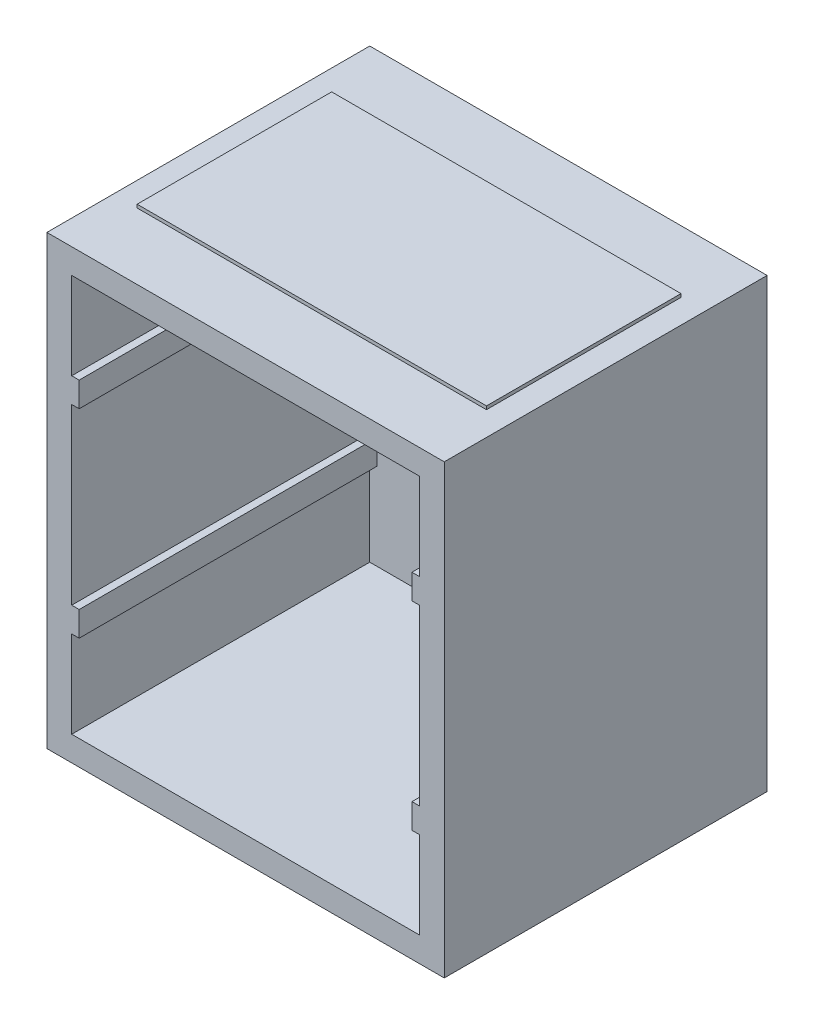
ISO-10303-21;
HEADER;
FILE_DESCRIPTION(('STEP AP214'),'2;1');
FILE_NAME('part.step','',(''),(''),'','','');
FILE_SCHEMA(('AUTOMOTIVE_DESIGN { 1 0 10303 214 1 1 1 1 }'));
ENDSEC;
DATA;
#1=APPLICATION_CONTEXT('core data for automotive mechanical design processes');
#2=APPLICATION_PROTOCOL_DEFINITION('international standard','automotive_design',2000,#1);
#3=PRODUCT_CONTEXT('',#1,'mechanical');
#4=PRODUCT('Part','Part','',(#3));
#5=PRODUCT_RELATED_PRODUCT_CATEGORY('part','',(#4));
#6=PRODUCT_DEFINITION_FORMATION('','',#4);
#7=PRODUCT_DEFINITION_CONTEXT('part definition',#1,'design');
#8=PRODUCT_DEFINITION('design','',#6,#7);
#9=PRODUCT_DEFINITION_SHAPE('','',#8);
#10=(LENGTH_UNIT() NAMED_UNIT(*) SI_UNIT(.MILLI.,.METRE.));
#11=(NAMED_UNIT(*) PLANE_ANGLE_UNIT() SI_UNIT($,.RADIAN.));
#12=(NAMED_UNIT(*) SI_UNIT($,.STERADIAN.) SOLID_ANGLE_UNIT());
#13=UNCERTAINTY_MEASURE_WITH_UNIT(LENGTH_MEASURE(1.E-05),#10,'distance_accuracy_value','');
#14=(GEOMETRIC_REPRESENTATION_CONTEXT(3) GLOBAL_UNCERTAINTY_ASSIGNED_CONTEXT((#13)) GLOBAL_UNIT_ASSIGNED_CONTEXT((#10,
#11,#12)) REPRESENTATION_CONTEXT('',''));
#15=CARTESIAN_POINT('',(0.,0.,0.));
#16=DIRECTION('',(0.,0.,1.));
#17=DIRECTION('',(1.,0.,0.));
#18=AXIS2_PLACEMENT_3D('',#15,#16,#17);
#19=CARTESIAN_POINT('',(133.35,171.45,-296.855381165919));
#20=DIRECTION('',(1.,0.,0.));
#21=DIRECTION('',(0.,1.,0.));
#22=AXIS2_PLACEMENT_3D('',#19,#20,#21);
#23=PLANE('',#22);
#24=DIRECTION('',(0.,1.,0.));
#25=VECTOR('',#24,1.);
#26=CARTESIAN_POINT('',(133.35,0.,-277.805381165919));
#27=LINE('',#26,#25);
#28=CARTESIAN_POINT('',(133.35,85.725,-277.805381165919));
#29=VERTEX_POINT('',#28);
#30=CARTESIAN_POINT('',(133.35,152.4,-277.805381165919));
#31=VERTEX_POINT('',#30);
#32=EDGE_CURVE('E377',#29,#31,#27,.T.);
#33=ORIENTED_EDGE('',*,*,#32,.F.);
#34=DIRECTION('',(0.,0.,1.));
#35=VECTOR('',#34,1.);
#36=CARTESIAN_POINT('',(133.35,85.725,-49.2053811659192));
#37=LINE('',#36,#35);
#38=CARTESIAN_POINT('',(133.35,85.725,-49.2053811659192));
#39=VERTEX_POINT('',#38);
#40=EDGE_CURVE('E252',#29,#39,#37,.T.);
#41=ORIENTED_EDGE('',*,*,#40,.T.);
#42=DIRECTION('',(0.,1.,0.));
#43=VECTOR('',#42,1.);
#44=CARTESIAN_POINT('',(133.35,0.,-49.2053811659192));
#45=LINE('',#44,#43);
#46=CARTESIAN_POINT('',(133.35,152.4,-49.2053811659192));
#47=VERTEX_POINT('',#46);
#48=EDGE_CURVE('E367',#39,#47,#45,.T.);
#49=ORIENTED_EDGE('',*,*,#48,.T.);
#50=DIRECTION('',(0.,0.,1.));
#51=VECTOR('',#50,1.);
#52=CARTESIAN_POINT('',(133.35,152.4,-296.855381165919));
#53=LINE('',#52,#51);
#54=EDGE_CURVE('E378',#31,#47,#53,.T.);
#55=ORIENTED_EDGE('',*,*,#54,.F.);
#56=EDGE_LOOP('',(#33,#41,#49,#55));
#57=FACE_BOUND('',#56,.T.);
#58=ADVANCED_FACE('F45',(#57),#23,.F.);
#59=CARTESIAN_POINT('',(133.35,-66.675,-49.2053811659192));
#60=VERTEX_POINT('',#59);
#61=CARTESIAN_POINT('',(133.35,66.675,-49.2053811659192));
#62=VERTEX_POINT('',#61);
#63=EDGE_CURVE('E399',#60,#62,#45,.T.);
#64=ORIENTED_EDGE('',*,*,#63,.T.);
#65=DIRECTION('',(0.,0.,-1.));
#66=VECTOR('',#65,1.);
#67=CARTESIAN_POINT('',(133.35,66.675,-49.2053811659192));
#68=LINE('',#67,#66);
#69=CARTESIAN_POINT('',(133.35,66.675,-277.805381165919));
#70=VERTEX_POINT('',#69);
#71=EDGE_CURVE('E255',#62,#70,#68,.T.);
#72=ORIENTED_EDGE('',*,*,#71,.T.);
#73=CARTESIAN_POINT('',(133.35,-66.675,-277.805381165919));
#74=VERTEX_POINT('',#73);
#75=EDGE_CURVE('E376',#74,#70,#27,.T.);
#76=ORIENTED_EDGE('',*,*,#75,.F.);
#77=DIRECTION('',(0.,0.,1.));
#78=VECTOR('',#77,1.);
#79=CARTESIAN_POINT('',(133.35,-66.675,-49.2053811659192));
#80=LINE('',#79,#78);
#81=EDGE_CURVE('E284',#74,#60,#80,.T.);
#82=ORIENTED_EDGE('',*,*,#81,.T.);
#83=EDGE_LOOP('',(#64,#72,#76,#82));
#84=FACE_BOUND('',#83,.T.);
#85=ADVANCED_FACE('F461',(#84),#23,.F.);
#86=CARTESIAN_POINT('',(-133.35,171.45,-296.855381165919));
#87=DIRECTION('',(-1.,0.,0.));
#88=DIRECTION('',(0.,-1.,0.));
#89=AXIS2_PLACEMENT_3D('',#86,#87,#88);
#90=PLANE('',#89);
#91=DIRECTION('',(0.,0.,-1.));
#92=VECTOR('',#91,1.);
#93=CARTESIAN_POINT('',(-133.35,66.675,-49.2053811659192));
#94=LINE('',#93,#92);
#95=CARTESIAN_POINT('',(-133.35,66.675,-49.2053811659192));
#96=VERTEX_POINT('',#95);
#97=CARTESIAN_POINT('',(-133.35,66.675,-277.805381165919));
#98=VERTEX_POINT('',#97);
#99=EDGE_CURVE('E326',#96,#98,#94,.T.);
#100=ORIENTED_EDGE('',*,*,#99,.F.);
#101=DIRECTION('',(0.,-1.,0.));
#102=VECTOR('',#101,1.);
#103=CARTESIAN_POINT('',(-133.35,0.,-49.2053811659192));
#104=LINE('',#103,#102);
#105=CARTESIAN_POINT('',(-133.35,-66.675,-49.2053811659192));
#106=VERTEX_POINT('',#105);
#107=EDGE_CURVE('E406',#96,#106,#104,.T.);
#108=ORIENTED_EDGE('',*,*,#107,.T.);
#109=DIRECTION('',(0.,0.,1.));
#110=VECTOR('',#109,1.);
#111=CARTESIAN_POINT('',(-133.35,-66.675,-49.2053811659192));
#112=LINE('',#111,#110);
#113=CARTESIAN_POINT('',(-133.35,-66.675,-277.805381165919));
#114=VERTEX_POINT('',#113);
#115=EDGE_CURVE('E344',#114,#106,#112,.T.);
#116=ORIENTED_EDGE('',*,*,#115,.F.);
#117=DIRECTION('',(0.,-1.,0.));
#118=VECTOR('',#117,1.);
#119=CARTESIAN_POINT('',(-133.35,0.,-277.805381165919));
#120=LINE('',#119,#118);
#121=EDGE_CURVE('E391',#98,#114,#120,.T.);
#122=ORIENTED_EDGE('',*,*,#121,.F.);
#123=EDGE_LOOP('',(#100,#108,#116,#122));
#124=FACE_BOUND('',#123,.T.);
#125=ADVANCED_FACE('F468',(#124),#90,.F.);
#126=DIRECTION('',(0.,0.,1.));
#127=VECTOR('',#126,1.);
#128=CARTESIAN_POINT('',(-133.35,85.725,-49.2053811659192));
#129=LINE('',#128,#127);
#130=CARTESIAN_POINT('',(-133.35,85.725,-277.805381165919));
#131=VERTEX_POINT('',#130);
#132=CARTESIAN_POINT('',(-133.35,85.725,-49.2053811659192));
#133=VERTEX_POINT('',#132);
#134=EDGE_CURVE('E323',#131,#133,#129,.T.);
#135=ORIENTED_EDGE('',*,*,#134,.F.);
#136=CARTESIAN_POINT('',(-133.35,152.4,-277.805381165919));
#137=VERTEX_POINT('',#136);
#138=EDGE_CURVE('E387',#137,#131,#120,.T.);
#139=ORIENTED_EDGE('',*,*,#138,.F.);
#140=DIRECTION('',(0.,0.,1.));
#141=VECTOR('',#140,1.);
#142=CARTESIAN_POINT('',(-133.35,152.4,-296.855381165919));
#143=LINE('',#142,#141);
#144=CARTESIAN_POINT('',(-133.35,152.4,-49.2053811659192));
#145=VERTEX_POINT('',#144);
#146=EDGE_CURVE('E381',#137,#145,#143,.T.);
#147=ORIENTED_EDGE('',*,*,#146,.T.);
#148=EDGE_CURVE('E403',#145,#133,#104,.T.);
#149=ORIENTED_EDGE('',*,*,#148,.T.);
#150=EDGE_LOOP('',(#135,#139,#147,#149));
#151=FACE_BOUND('',#150,.T.);
#152=ADVANCED_FACE('F528',(#151),#90,.F.);
#153=CARTESIAN_POINT('',(0.,0.,-277.805381165919));
#154=DIRECTION('',(0.,0.,1.));
#155=DIRECTION('',(1.,0.,0.));
#156=AXIS2_PLACEMENT_3D('',#153,#154,#155);
#157=PLANE('',#156);
#158=DIRECTION('',(1.,0.,0.));
#159=VECTOR('',#158,1.);
#160=CARTESIAN_POINT('',(127.635,85.725,-277.805381165919));
#161=LINE('',#160,#159);
#162=CARTESIAN_POINT('',(127.635,85.725,-277.805381165919));
#163=VERTEX_POINT('',#162);
#164=EDGE_CURVE('E279',#163,#29,#161,.T.);
#165=ORIENTED_EDGE('',*,*,#164,.T.);
#166=ORIENTED_EDGE('',*,*,#32,.T.);
#167=DIRECTION('',(-1.,0.,0.));
#168=VECTOR('',#167,1.);
#169=CARTESIAN_POINT('',(0.,152.4,-277.805381165919));
#170=LINE('',#169,#168);
#171=EDGE_CURVE('E375',#31,#137,#170,.T.);
#172=ORIENTED_EDGE('',*,*,#171,.T.);
#173=ORIENTED_EDGE('',*,*,#138,.T.);
#174=DIRECTION('',(-1.,0.,0.));
#175=VECTOR('',#174,1.);
#176=CARTESIAN_POINT('',(-127.635,85.725,-277.805381165919));
#177=LINE('',#176,#175);
#178=CARTESIAN_POINT('',(-127.635,85.725,-277.805381165919));
#179=VERTEX_POINT('',#178);
#180=EDGE_CURVE('E316',#179,#131,#177,.T.);
#181=ORIENTED_EDGE('',*,*,#180,.F.);
#182=DIRECTION('',(0.,1.,0.));
#183=VECTOR('',#182,1.);
#184=CARTESIAN_POINT('',(-127.635,85.725,-277.805381165919));
#185=LINE('',#184,#183);
#186=CARTESIAN_POINT('',(-127.635,66.675,-277.805381165919));
#187=VERTEX_POINT('',#186);
#188=EDGE_CURVE('E332',#187,#179,#185,.T.);
#189=ORIENTED_EDGE('',*,*,#188,.F.);
#190=DIRECTION('',(-1.,0.,0.));
#191=VECTOR('',#190,1.);
#192=CARTESIAN_POINT('',(-127.635,66.675,-277.805381165919));
#193=LINE('',#192,#191);
#194=EDGE_CURVE('E314',#187,#98,#193,.T.);
#195=ORIENTED_EDGE('',*,*,#194,.T.);
#196=ORIENTED_EDGE('',*,*,#121,.T.);
#197=DIRECTION('',(-1.,0.,0.));
#198=VECTOR('',#197,1.);
#199=CARTESIAN_POINT('',(-127.635,-66.675,-277.805381165919));
#200=LINE('',#199,#198);
#201=CARTESIAN_POINT('',(-127.635,-66.675,-277.805381165919));
#202=VERTEX_POINT('',#201);
#203=EDGE_CURVE('E359',#202,#114,#200,.T.);
#204=ORIENTED_EDGE('',*,*,#203,.F.);
#205=DIRECTION('',(0.,1.,0.));
#206=VECTOR('',#205,1.);
#207=CARTESIAN_POINT('',(-127.635,-66.675,-277.805381165919));
#208=LINE('',#207,#206);
#209=CARTESIAN_POINT('',(-127.635,-85.725,-277.805381165919));
#210=VERTEX_POINT('',#209);
#211=EDGE_CURVE('E347',#210,#202,#208,.T.);
#212=ORIENTED_EDGE('',*,*,#211,.F.);
#213=DIRECTION('',(-1.,0.,0.));
#214=VECTOR('',#213,1.);
#215=CARTESIAN_POINT('',(-127.635,-85.725,-277.805381165919));
#216=LINE('',#215,#214);
#217=CARTESIAN_POINT('',(-133.35,-85.725,-277.805381165919));
#218=VERTEX_POINT('',#217);
#219=EDGE_CURVE('E362',#210,#218,#216,.T.);
#220=ORIENTED_EDGE('',*,*,#219,.T.);
#221=CARTESIAN_POINT('',(-133.35,-152.4,-277.805381165919));
#222=VERTEX_POINT('',#221);
#223=EDGE_CURVE('E392',#218,#222,#120,.T.);
#224=ORIENTED_EDGE('',*,*,#223,.T.);
#225=DIRECTION('',(1.,0.,0.));
#226=VECTOR('',#225,1.);
#227=CARTESIAN_POINT('',(0.,-152.4,-277.805381165919));
#228=LINE('',#227,#226);
#229=CARTESIAN_POINT('',(133.35,-152.4,-277.805381165919));
#230=VERTEX_POINT('',#229);
#231=EDGE_CURVE('E382',#222,#230,#228,.T.);
#232=ORIENTED_EDGE('',*,*,#231,.T.);
#233=CARTESIAN_POINT('',(133.35,-85.725,-277.805381165919));
#234=VERTEX_POINT('',#233);
#235=EDGE_CURVE('E372',#230,#234,#27,.T.);
#236=ORIENTED_EDGE('',*,*,#235,.T.);
#237=DIRECTION('',(1.,0.,0.));
#238=VECTOR('',#237,1.);
#239=CARTESIAN_POINT('',(127.635,-85.725,-277.805381165919));
#240=LINE('',#239,#238);
#241=CARTESIAN_POINT('',(127.635,-85.725,-277.805381165919));
#242=VERTEX_POINT('',#241);
#243=EDGE_CURVE('E304',#242,#234,#240,.T.);
#244=ORIENTED_EDGE('',*,*,#243,.F.);
#245=DIRECTION('',(0.,1.,0.));
#246=VECTOR('',#245,1.);
#247=CARTESIAN_POINT('',(127.635,-66.675,-277.805381165919));
#248=LINE('',#247,#246);
#249=CARTESIAN_POINT('',(127.635,-66.675,-277.805381165919));
#250=VERTEX_POINT('',#249);
#251=EDGE_CURVE('E292',#242,#250,#248,.T.);
#252=ORIENTED_EDGE('',*,*,#251,.T.);
#253=DIRECTION('',(1.,0.,0.));
#254=VECTOR('',#253,1.);
#255=CARTESIAN_POINT('',(127.635,-66.675,-277.805381165919));
#256=LINE('',#255,#254);
#257=EDGE_CURVE('E306',#250,#74,#256,.T.);
#258=ORIENTED_EDGE('',*,*,#257,.T.);
#259=ORIENTED_EDGE('',*,*,#75,.T.);
#260=DIRECTION('',(1.,0.,0.));
#261=VECTOR('',#260,1.);
#262=CARTESIAN_POINT('',(127.635,66.675,-277.805381165919));
#263=LINE('',#262,#261);
#264=CARTESIAN_POINT('',(127.635,66.675,-277.805381165919));
#265=VERTEX_POINT('',#264);
#266=EDGE_CURVE('E276',#265,#70,#263,.T.);
#267=ORIENTED_EDGE('',*,*,#266,.F.);
#268=DIRECTION('',(0.,1.,0.));
#269=VECTOR('',#268,1.);
#270=CARTESIAN_POINT('',(127.635,85.725,-277.805381165919));
#271=LINE('',#270,#269);
#272=EDGE_CURVE('E267',#265,#163,#271,.T.);
#273=ORIENTED_EDGE('',*,*,#272,.T.);
#274=EDGE_LOOP('',(#165,#166,#172,#173,#181,#189,#195,#196,#204,#212,#220,#224,#232,#236,#244,
#252,#258,#259,#267,#273));
#275=FACE_BOUND('',#274,.T.);
#276=ADVANCED_FACE('F495',(#275),#157,.T.);
#277=DIRECTION('',(0.,0.,-1.));
#278=VECTOR('',#277,1.);
#279=CARTESIAN_POINT('',(-133.35,-85.725,-49.2053811659192));
#280=LINE('',#279,#278);
#281=CARTESIAN_POINT('',(-133.35,-85.725,-49.2053811659192));
#282=VERTEX_POINT('',#281);
#283=EDGE_CURVE('E330',#282,#218,#280,.T.);
#284=ORIENTED_EDGE('',*,*,#283,.F.);
#285=CARTESIAN_POINT('',(-133.35,-152.4,-49.2053811659192));
#286=VERTEX_POINT('',#285);
#287=EDGE_CURVE('E402',#282,#286,#104,.T.);
#288=ORIENTED_EDGE('',*,*,#287,.T.);
#289=DIRECTION('',(0.,0.,1.));
#290=VECTOR('',#289,1.);
#291=CARTESIAN_POINT('',(-133.35,-152.4,-296.855381165919));
#292=LINE('',#291,#290);
#293=EDGE_CURVE('E371',#222,#286,#292,.T.);
#294=ORIENTED_EDGE('',*,*,#293,.F.);
#295=ORIENTED_EDGE('',*,*,#223,.F.);
#296=EDGE_LOOP('',(#284,#288,#294,#295));
#297=FACE_BOUND('',#296,.T.);
#298=ADVANCED_FACE('F500',(#297),#90,.F.);
#299=CARTESIAN_POINT('',(152.4,171.45,-296.855381165919));
#300=DIRECTION('',(1.,0.,0.));
#301=DIRECTION('',(0.,1.,0.));
#302=AXIS2_PLACEMENT_3D('',#299,#300,#301);
#303=PLANE('',#302);
#304=DIRECTION('',(0.,1.,0.));
#305=VECTOR('',#304,1.);
#306=CARTESIAN_POINT('',(152.4,171.45,-49.2053811659192));
#307=LINE('',#306,#305);
#308=CARTESIAN_POINT('',(152.4,-171.45,-49.2053811659192));
#309=VERTEX_POINT('',#308);
#310=CARTESIAN_POINT('',(152.4,171.45,-49.2053811659192));
#311=VERTEX_POINT('',#310);
#312=EDGE_CURVE('E370',#309,#311,#307,.T.);
#313=ORIENTED_EDGE('',*,*,#312,.F.);
#314=DIRECTION('',(0.,0.,1.));
#315=VECTOR('',#314,1.);
#316=CARTESIAN_POINT('',(152.4,-171.45,-296.855381165919));
#317=LINE('',#316,#315);
#318=CARTESIAN_POINT('',(152.4,-171.45,-296.855381165919));
#319=VERTEX_POINT('',#318);
#320=EDGE_CURVE('E11',#319,#309,#317,.T.);
#321=ORIENTED_EDGE('',*,*,#320,.F.);
#322=DIRECTION('',(0.,1.,0.));
#323=VECTOR('',#322,1.);
#324=CARTESIAN_POINT('',(152.4,171.45,-296.855381165919));
#325=LINE('',#324,#323);
#326=CARTESIAN_POINT('',(152.4,171.45,-296.855381165919));
#327=VERTEX_POINT('',#326);
#328=EDGE_CURVE('E409',#319,#327,#325,.T.);
#329=ORIENTED_EDGE('',*,*,#328,.T.);
#330=DIRECTION('',(0.,0.,1.));
#331=VECTOR('',#330,1.);
#332=CARTESIAN_POINT('',(152.4,171.45,-296.855381165919));
#333=LINE('',#332,#331);
#334=EDGE_CURVE('E49',#327,#311,#333,.T.);
#335=ORIENTED_EDGE('',*,*,#334,.T.);
#336=EDGE_LOOP('',(#313,#321,#329,#335));
#337=FACE_BOUND('',#336,.T.);
#338=ADVANCED_FACE('F47',(#337),#303,.T.);
#339=CARTESIAN_POINT('',(-152.4,-171.45,-296.855381165919));
#340=DIRECTION('',(0.,-1.,0.));
#341=DIRECTION('',(0.,0.,-1.));
#342=AXIS2_PLACEMENT_3D('',#339,#340,#341);
#343=PLANE('',#342);
#344=DIRECTION('',(1.,0.,0.));
#345=VECTOR('',#344,1.);
#346=CARTESIAN_POINT('',(-152.4,-171.45,-49.2053811659192));
#347=LINE('',#346,#345);
#348=CARTESIAN_POINT('',(-152.4,-171.45,-49.2053811659192));
#349=VERTEX_POINT('',#348);
#350=EDGE_CURVE('E413',#349,#309,#347,.T.);
#351=ORIENTED_EDGE('',*,*,#350,.F.);
#352=DIRECTION('',(0.,0.,1.));
#353=VECTOR('',#352,1.);
#354=CARTESIAN_POINT('',(-152.4,-171.45,-296.855381165919));
#355=LINE('',#354,#353);
#356=CARTESIAN_POINT('',(-152.4,-171.45,-296.855381165919));
#357=VERTEX_POINT('',#356);
#358=EDGE_CURVE('E54',#357,#349,#355,.T.);
#359=ORIENTED_EDGE('',*,*,#358,.F.);
#360=DIRECTION('',(1.,0.,0.));
#361=VECTOR('',#360,1.);
#362=CARTESIAN_POINT('',(-152.4,-171.45,-296.855381165919));
#363=LINE('',#362,#361);
#364=EDGE_CURVE('E419',#357,#319,#363,.T.);
#365=ORIENTED_EDGE('',*,*,#364,.T.);
#366=ORIENTED_EDGE('',*,*,#320,.T.);
#367=EDGE_LOOP('',(#351,#359,#365,#366));
#368=FACE_BOUND('',#367,.T.);
#369=ADVANCED_FACE('F445',(#368),#343,.T.);
#370=CARTESIAN_POINT('',(-152.4,171.45,-296.855381165919));
#371=DIRECTION('',(-1.,0.,0.));
#372=DIRECTION('',(0.,-1.,0.));
#373=AXIS2_PLACEMENT_3D('',#370,#371,#372);
#374=PLANE('',#373);
#375=DIRECTION('',(0.,-1.,0.));
#376=VECTOR('',#375,1.);
#377=CARTESIAN_POINT('',(-152.4,171.45,-49.2053811659192));
#378=LINE('',#377,#376);
#379=CARTESIAN_POINT('',(-152.4,171.45,-49.2053811659192));
#380=VERTEX_POINT('',#379);
#381=EDGE_CURVE('E427',#380,#349,#378,.T.);
#382=ORIENTED_EDGE('',*,*,#381,.F.);
#383=DIRECTION('',(0.,0.,1.));
#384=VECTOR('',#383,1.);
#385=CARTESIAN_POINT('',(-152.4,171.45,-296.855381165919));
#386=LINE('',#385,#384);
#387=CARTESIAN_POINT('',(-152.4,171.45,-296.855381165919));
#388=VERTEX_POINT('',#387);
#389=EDGE_CURVE('E432',#388,#380,#386,.T.);
#390=ORIENTED_EDGE('',*,*,#389,.F.);
#391=DIRECTION('',(0.,-1.,0.));
#392=VECTOR('',#391,1.);
#393=CARTESIAN_POINT('',(-152.4,171.45,-296.855381165919));
#394=LINE('',#393,#392);
#395=EDGE_CURVE('E416',#388,#357,#394,.T.);
#396=ORIENTED_EDGE('',*,*,#395,.T.);
#397=ORIENTED_EDGE('',*,*,#358,.T.);
#398=EDGE_LOOP('',(#382,#390,#396,#397));
#399=FACE_BOUND('',#398,.T.);
#400=ADVANCED_FACE('F451',(#399),#374,.T.);
#401=CARTESIAN_POINT('',(-152.4,171.45,-296.855381165919));
#402=DIRECTION('',(0.,1.,0.));
#403=DIRECTION('',(0.,0.,1.));
#404=AXIS2_PLACEMENT_3D('',#401,#402,#403);
#405=PLANE('',#404);
#406=DIRECTION('',(-1.,0.,0.));
#407=VECTOR('',#406,1.);
#408=CARTESIAN_POINT('',(133.985,171.45,-249.230381165919));
#409=LINE('',#408,#407);
#410=CARTESIAN_POINT('',(133.985,171.45,-249.230381165919));
#411=VERTEX_POINT('',#410);
#412=CARTESIAN_POINT('',(-133.985,171.45,-249.230381165919));
#413=VERTEX_POINT('',#412);
#414=EDGE_CURVE('E62',#411,#413,#409,.T.);
#415=ORIENTED_EDGE('',*,*,#414,.F.);
#416=DIRECTION('',(0.,0.,1.));
#417=VECTOR('',#416,1.);
#418=CARTESIAN_POINT('',(133.985,171.45,-249.230381165919));
#419=LINE('',#418,#417);
#420=CARTESIAN_POINT('',(133.985,171.45,-100.005381165919));
#421=VERTEX_POINT('',#420);
#422=EDGE_CURVE('E67',#411,#421,#419,.T.);
#423=ORIENTED_EDGE('',*,*,#422,.T.);
#424=DIRECTION('',(-1.,0.,0.));
#425=VECTOR('',#424,1.);
#426=CARTESIAN_POINT('',(133.985,171.45,-100.005381165919));
#427=LINE('',#426,#425);
#428=CARTESIAN_POINT('',(-133.985,171.45,-100.005381165919));
#429=VERTEX_POINT('',#428);
#430=EDGE_CURVE('E687',#421,#429,#427,.T.);
#431=ORIENTED_EDGE('',*,*,#430,.T.);
#432=DIRECTION('',(0.,0.,1.));
#433=VECTOR('',#432,1.);
#434=CARTESIAN_POINT('',(-133.985,171.45,-249.230381165919));
#435=LINE('',#434,#433);
#436=EDGE_CURVE('E689',#413,#429,#435,.T.);
#437=ORIENTED_EDGE('',*,*,#436,.F.);
#438=EDGE_LOOP('',(#415,#423,#431,#437));
#439=FACE_BOUND('',#438,.T.);
#440=DIRECTION('',(-1.,0.,0.));
#441=VECTOR('',#440,1.);
#442=CARTESIAN_POINT('',(-152.4,171.45,-49.2053811659192));
#443=LINE('',#442,#441);
#444=EDGE_CURVE('E424',#311,#380,#443,.T.);
#445=ORIENTED_EDGE('',*,*,#444,.F.);
#446=ORIENTED_EDGE('',*,*,#334,.F.);
#447=DIRECTION('',(-1.,0.,0.));
#448=VECTOR('',#447,1.);
#449=CARTESIAN_POINT('',(-152.4,171.45,-296.855381165919));
#450=LINE('',#449,#448);
#451=EDGE_CURVE('E412',#327,#388,#450,.T.);
#452=ORIENTED_EDGE('',*,*,#451,.T.);
#453=ORIENTED_EDGE('',*,*,#389,.T.);
#454=EDGE_LOOP('',(#445,#446,#452,#453));
#455=FACE_BOUND('',#454,.T.);
#456=ADVANCED_FACE('F440',(#439,#455),#405,.T.);
#457=CARTESIAN_POINT('',(0.,0.,-296.855381165919));
#458=DIRECTION('',(0.,0.,1.));
#459=DIRECTION('',(1.,0.,0.));
#460=AXIS2_PLACEMENT_3D('',#457,#458,#459);
#461=PLANE('',#460);
#462=ORIENTED_EDGE('',*,*,#328,.F.);
#463=ORIENTED_EDGE('',*,*,#364,.F.);
#464=ORIENTED_EDGE('',*,*,#395,.F.);
#465=ORIENTED_EDGE('',*,*,#451,.F.);
#466=EDGE_LOOP('',(#462,#463,#464,#465));
#467=FACE_BOUND('',#466,.T.);
#468=ADVANCED_FACE('F448',(#467),#461,.F.);
#469=CARTESIAN_POINT('',(0.,0.,-49.2053811659192));
#470=DIRECTION('',(0.,0.,1.));
#471=DIRECTION('',(1.,0.,0.));
#472=AXIS2_PLACEMENT_3D('',#469,#470,#471);
#473=PLANE('',#472);
#474=CARTESIAN_POINT('',(133.35,-152.4,-49.2053811659192));
#475=VERTEX_POINT('',#474);
#476=CARTESIAN_POINT('',(133.35,-85.725,-49.2053811659192));
#477=VERTEX_POINT('',#476);
#478=EDGE_CURVE('E395',#475,#477,#45,.T.);
#479=ORIENTED_EDGE('',*,*,#478,.F.);
#480=DIRECTION('',(1.,0.,0.));
#481=VECTOR('',#480,1.);
#482=CARTESIAN_POINT('',(0.,-152.4,-49.2053811659192));
#483=LINE('',#482,#481);
#484=EDGE_CURVE('E405',#286,#475,#483,.T.);
#485=ORIENTED_EDGE('',*,*,#484,.F.);
#486=ORIENTED_EDGE('',*,*,#287,.F.);
#487=DIRECTION('',(-1.,0.,0.));
#488=VECTOR('',#487,1.);
#489=CARTESIAN_POINT('',(-127.635,-85.725,-49.2053811659192));
#490=LINE('',#489,#488);
#491=CARTESIAN_POINT('',(-127.635,-85.725,-49.2053811659192));
#492=VERTEX_POINT('',#491);
#493=EDGE_CURVE('E364',#492,#282,#490,.T.);
#494=ORIENTED_EDGE('',*,*,#493,.F.);
#495=DIRECTION('',(0.,-1.,0.));
#496=VECTOR('',#495,1.);
#497=CARTESIAN_POINT('',(-127.635,-66.675,-49.2053811659192));
#498=LINE('',#497,#496);
#499=CARTESIAN_POINT('',(-127.635,-66.675,-49.2053811659192));
#500=VERTEX_POINT('',#499);
#501=EDGE_CURVE('E340',#500,#492,#498,.T.);
#502=ORIENTED_EDGE('',*,*,#501,.F.);
#503=DIRECTION('',(-1.,0.,0.));
#504=VECTOR('',#503,1.);
#505=CARTESIAN_POINT('',(-127.635,-66.675,-49.2053811659192));
#506=LINE('',#505,#504);
#507=EDGE_CURVE('E352',#500,#106,#506,.T.);
#508=ORIENTED_EDGE('',*,*,#507,.T.);
#509=ORIENTED_EDGE('',*,*,#107,.F.);
#510=DIRECTION('',(-1.,0.,0.));
#511=VECTOR('',#510,1.);
#512=CARTESIAN_POINT('',(-127.635,66.675,-49.2053811659192));
#513=LINE('',#512,#511);
#514=CARTESIAN_POINT('',(-127.635,66.675,-49.2053811659192));
#515=VERTEX_POINT('',#514);
#516=EDGE_CURVE('E311',#515,#96,#513,.T.);
#517=ORIENTED_EDGE('',*,*,#516,.F.);
#518=DIRECTION('',(0.,-1.,0.));
#519=VECTOR('',#518,1.);
#520=CARTESIAN_POINT('',(-127.635,85.725,-49.2053811659192));
#521=LINE('',#520,#519);
#522=CARTESIAN_POINT('',(-127.635,85.725,-49.2053811659192));
#523=VERTEX_POINT('',#522);
#524=EDGE_CURVE('E327',#523,#515,#521,.T.);
#525=ORIENTED_EDGE('',*,*,#524,.F.);
#526=DIRECTION('',(-1.,0.,0.));
#527=VECTOR('',#526,1.);
#528=CARTESIAN_POINT('',(-127.635,85.725,-49.2053811659192));
#529=LINE('',#528,#527);
#530=EDGE_CURVE('E319',#523,#133,#529,.T.);
#531=ORIENTED_EDGE('',*,*,#530,.T.);
#532=ORIENTED_EDGE('',*,*,#148,.F.);
#533=DIRECTION('',(-1.,0.,0.));
#534=VECTOR('',#533,1.);
#535=CARTESIAN_POINT('',(0.,152.4,-49.2053811659192));
#536=LINE('',#535,#534);
#537=EDGE_CURVE('E398',#47,#145,#536,.T.);
#538=ORIENTED_EDGE('',*,*,#537,.F.);
#539=ORIENTED_EDGE('',*,*,#48,.F.);
#540=DIRECTION('',(1.,0.,0.));
#541=VECTOR('',#540,1.);
#542=CARTESIAN_POINT('',(127.635,85.725,-49.2053811659192));
#543=LINE('',#542,#541);
#544=CARTESIAN_POINT('',(127.635,85.725,-49.2053811659192));
#545=VERTEX_POINT('',#544);
#546=EDGE_CURVE('E281',#545,#39,#543,.T.);
#547=ORIENTED_EDGE('',*,*,#546,.F.);
#548=DIRECTION('',(0.,-1.,0.));
#549=VECTOR('',#548,1.);
#550=CARTESIAN_POINT('',(127.635,85.725,-49.2053811659192));
#551=LINE('',#550,#549);
#552=CARTESIAN_POINT('',(127.635,66.675,-49.2053811659192));
#553=VERTEX_POINT('',#552);
#554=EDGE_CURVE('E261',#545,#553,#551,.T.);
#555=ORIENTED_EDGE('',*,*,#554,.T.);
#556=DIRECTION('',(1.,0.,0.));
#557=VECTOR('',#556,1.);
#558=CARTESIAN_POINT('',(127.635,66.675,-49.2053811659192));
#559=LINE('',#558,#557);
#560=EDGE_CURVE('E271',#553,#62,#559,.T.);
#561=ORIENTED_EDGE('',*,*,#560,.T.);
#562=ORIENTED_EDGE('',*,*,#63,.F.);
#563=DIRECTION('',(1.,0.,0.));
#564=VECTOR('',#563,1.);
#565=CARTESIAN_POINT('',(127.635,-66.675,-49.2053811659192));
#566=LINE('',#565,#564);
#567=CARTESIAN_POINT('',(127.635,-66.675,-49.2053811659192));
#568=VERTEX_POINT('',#567);
#569=EDGE_CURVE('E309',#568,#60,#566,.T.);
#570=ORIENTED_EDGE('',*,*,#569,.F.);
#571=DIRECTION('',(0.,-1.,0.));
#572=VECTOR('',#571,1.);
#573=CARTESIAN_POINT('',(127.635,-66.675,-49.2053811659192));
#574=LINE('',#573,#572);
#575=CARTESIAN_POINT('',(127.635,-85.725,-49.2053811659192));
#576=VERTEX_POINT('',#575);
#577=EDGE_CURVE('E285',#568,#576,#574,.T.);
#578=ORIENTED_EDGE('',*,*,#577,.T.);
#579=DIRECTION('',(1.,0.,0.));
#580=VECTOR('',#579,1.);
#581=CARTESIAN_POINT('',(127.635,-85.725,-49.2053811659192));
#582=LINE('',#581,#580);
#583=EDGE_CURVE('E298',#576,#477,#582,.T.);
#584=ORIENTED_EDGE('',*,*,#583,.T.);
#585=EDGE_LOOP('',(#479,#485,#486,#494,#502,#508,#509,#517,#525,#531,#532,#538,#539,#547,#555,
#561,#562,#570,#578,#584));
#586=FACE_BOUND('',#585,.T.);
#587=ORIENTED_EDGE('',*,*,#312,.T.);
#588=ORIENTED_EDGE('',*,*,#444,.T.);
#589=ORIENTED_EDGE('',*,*,#381,.T.);
#590=ORIENTED_EDGE('',*,*,#350,.T.);
#591=EDGE_LOOP('',(#587,#588,#589,#590));
#592=FACE_BOUND('',#591,.T.);
#593=ADVANCED_FACE('F442',(#586,#592),#473,.T.);
#594=ORIENTED_EDGE('',*,*,#478,.T.);
#595=DIRECTION('',(0.,0.,-1.));
#596=VECTOR('',#595,1.);
#597=CARTESIAN_POINT('',(133.35,-85.725,-49.2053811659192));
#598=LINE('',#597,#596);
#599=EDGE_CURVE('E289',#477,#234,#598,.T.);
#600=ORIENTED_EDGE('',*,*,#599,.T.);
#601=ORIENTED_EDGE('',*,*,#235,.F.);
#602=DIRECTION('',(0.,0.,1.));
#603=VECTOR('',#602,1.);
#604=CARTESIAN_POINT('',(133.35,-152.4,-296.855381165919));
#605=LINE('',#604,#603);
#606=EDGE_CURVE('E368',#230,#475,#605,.T.);
#607=ORIENTED_EDGE('',*,*,#606,.T.);
#608=EDGE_LOOP('',(#594,#600,#601,#607));
#609=FACE_BOUND('',#608,.T.);
#610=ADVANCED_FACE('F464',(#609),#23,.F.);
#611=CARTESIAN_POINT('',(-152.4,-152.4,-296.855381165919));
#612=DIRECTION('',(0.,-1.,0.));
#613=DIRECTION('',(0.,0.,-1.));
#614=AXIS2_PLACEMENT_3D('',#611,#612,#613);
#615=PLANE('',#614);
#616=ORIENTED_EDGE('',*,*,#484,.T.);
#617=ORIENTED_EDGE('',*,*,#606,.F.);
#618=ORIENTED_EDGE('',*,*,#231,.F.);
#619=ORIENTED_EDGE('',*,*,#293,.T.);
#620=EDGE_LOOP('',(#616,#617,#618,#619));
#621=FACE_BOUND('',#620,.T.);
#622=ADVANCED_FACE('F474',(#621),#615,.F.);
#623=CARTESIAN_POINT('',(-152.4,152.4,-296.855381165919));
#624=DIRECTION('',(0.,1.,0.));
#625=DIRECTION('',(0.,0.,1.));
#626=AXIS2_PLACEMENT_3D('',#623,#624,#625);
#627=PLANE('',#626);
#628=ORIENTED_EDGE('',*,*,#537,.T.);
#629=ORIENTED_EDGE('',*,*,#146,.F.);
#630=ORIENTED_EDGE('',*,*,#171,.F.);
#631=ORIENTED_EDGE('',*,*,#54,.T.);
#632=EDGE_LOOP('',(#628,#629,#630,#631));
#633=FACE_BOUND('',#632,.T.);
#634=ADVANCED_FACE('F480',(#633),#627,.F.);
#635=CARTESIAN_POINT('',(-127.635,-85.725,-49.2053811659192));
#636=DIRECTION('',(0.,1.,0.));
#637=DIRECTION('',(-1.,0.,0.));
#638=AXIS2_PLACEMENT_3D('',#635,#636,#637);
#639=PLANE('',#638);
#640=ORIENTED_EDGE('',*,*,#283,.T.);
#641=ORIENTED_EDGE('',*,*,#219,.F.);
#642=DIRECTION('',(0.,0.,-1.));
#643=VECTOR('',#642,1.);
#644=CARTESIAN_POINT('',(-127.635,-85.725,-49.2053811659192));
#645=LINE('',#644,#643);
#646=EDGE_CURVE('E343',#492,#210,#645,.T.);
#647=ORIENTED_EDGE('',*,*,#646,.F.);
#648=ORIENTED_EDGE('',*,*,#493,.T.);
#649=EDGE_LOOP('',(#640,#641,#647,#648));
#650=FACE_BOUND('',#649,.T.);
#651=ADVANCED_FACE('F575',(#650),#639,.F.);
#652=CARTESIAN_POINT('',(-127.635,-66.675,-49.2053811659192));
#653=DIRECTION('',(0.,-1.,0.));
#654=DIRECTION('',(1.,0.,0.));
#655=AXIS2_PLACEMENT_3D('',#652,#653,#654);
#656=PLANE('',#655);
#657=ORIENTED_EDGE('',*,*,#115,.T.);
#658=ORIENTED_EDGE('',*,*,#507,.F.);
#659=DIRECTION('',(0.,0.,1.));
#660=VECTOR('',#659,1.);
#661=CARTESIAN_POINT('',(-127.635,-66.675,-49.2053811659192));
#662=LINE('',#661,#660);
#663=EDGE_CURVE('E350',#202,#500,#662,.T.);
#664=ORIENTED_EDGE('',*,*,#663,.F.);
#665=ORIENTED_EDGE('',*,*,#203,.T.);
#666=EDGE_LOOP('',(#657,#658,#664,#665));
#667=FACE_BOUND('',#666,.T.);
#668=ADVANCED_FACE('F509',(#667),#656,.F.);
#669=CARTESIAN_POINT('',(-127.635,0.,-49.2053811659192));
#670=DIRECTION('',(1.,0.,0.));
#671=DIRECTION('',(0.,0.,-1.));
#672=AXIS2_PLACEMENT_3D('',#669,#670,#671);
#673=PLANE('',#672);
#674=ORIENTED_EDGE('',*,*,#501,.T.);
#675=ORIENTED_EDGE('',*,*,#646,.T.);
#676=ORIENTED_EDGE('',*,*,#211,.T.);
#677=ORIENTED_EDGE('',*,*,#663,.T.);
#678=EDGE_LOOP('',(#674,#675,#676,#677));
#679=FACE_BOUND('',#678,.T.);
#680=ADVANCED_FACE('F513',(#679),#673,.T.);
#681=CARTESIAN_POINT('',(-127.635,66.675,-49.2053811659192));
#682=DIRECTION('',(0.,1.,0.));
#683=DIRECTION('',(-1.,0.,0.));
#684=AXIS2_PLACEMENT_3D('',#681,#682,#683);
#685=PLANE('',#684);
#686=ORIENTED_EDGE('',*,*,#99,.T.);
#687=ORIENTED_EDGE('',*,*,#194,.F.);
#688=DIRECTION('',(0.,0.,-1.));
#689=VECTOR('',#688,1.);
#690=CARTESIAN_POINT('',(-127.635,66.675,-49.2053811659192));
#691=LINE('',#690,#689);
#692=EDGE_CURVE('E335',#515,#187,#691,.T.);
#693=ORIENTED_EDGE('',*,*,#692,.F.);
#694=ORIENTED_EDGE('',*,*,#516,.T.);
#695=EDGE_LOOP('',(#686,#687,#693,#694));
#696=FACE_BOUND('',#695,.T.);
#697=ADVANCED_FACE('F517',(#696),#685,.F.);
#698=CARTESIAN_POINT('',(-127.635,85.725,-49.2053811659192));
#699=DIRECTION('',(0.,-1.,0.));
#700=DIRECTION('',(1.,0.,0.));
#701=AXIS2_PLACEMENT_3D('',#698,#699,#700);
#702=PLANE('',#701);
#703=ORIENTED_EDGE('',*,*,#134,.T.);
#704=ORIENTED_EDGE('',*,*,#530,.F.);
#705=DIRECTION('',(0.,0.,1.));
#706=VECTOR('',#705,1.);
#707=CARTESIAN_POINT('',(-127.635,85.725,-49.2053811659192));
#708=LINE('',#707,#706);
#709=EDGE_CURVE('E322',#179,#523,#708,.T.);
#710=ORIENTED_EDGE('',*,*,#709,.F.);
#711=ORIENTED_EDGE('',*,*,#180,.T.);
#712=EDGE_LOOP('',(#703,#704,#710,#711));
#713=FACE_BOUND('',#712,.T.);
#714=ADVANCED_FACE('F525',(#713),#702,.F.);
#715=CARTESIAN_POINT('',(-127.635,-1.4338103828893E-13,-49.2053811659192));
#716=DIRECTION('',(1.,0.,0.));
#717=DIRECTION('',(0.,1.,0.));
#718=AXIS2_PLACEMENT_3D('',#715,#716,#717);
#719=PLANE('',#718);
#720=ORIENTED_EDGE('',*,*,#524,.T.);
#721=ORIENTED_EDGE('',*,*,#692,.T.);
#722=ORIENTED_EDGE('',*,*,#188,.T.);
#723=ORIENTED_EDGE('',*,*,#709,.T.);
#724=EDGE_LOOP('',(#720,#721,#722,#723));
#725=FACE_BOUND('',#724,.T.);
#726=ADVANCED_FACE('F522',(#725),#719,.T.);
#727=CARTESIAN_POINT('',(127.635,-66.675,-49.2053811659192));
#728=DIRECTION('',(0.,1.,0.));
#729=DIRECTION('',(-1.,0.,0.));
#730=AXIS2_PLACEMENT_3D('',#727,#728,#729);
#731=PLANE('',#730);
#732=ORIENTED_EDGE('',*,*,#81,.F.);
#733=ORIENTED_EDGE('',*,*,#257,.F.);
#734=DIRECTION('',(0.,0.,1.));
#735=VECTOR('',#734,1.);
#736=CARTESIAN_POINT('',(127.635,-66.675,-49.2053811659192));
#737=LINE('',#736,#735);
#738=EDGE_CURVE('E288',#250,#568,#737,.T.);
#739=ORIENTED_EDGE('',*,*,#738,.T.);
#740=ORIENTED_EDGE('',*,*,#569,.T.);
#741=EDGE_LOOP('',(#732,#733,#739,#740));
#742=FACE_BOUND('',#741,.T.);
#743=ADVANCED_FACE('F551',(#742),#731,.T.);
#744=CARTESIAN_POINT('',(127.635,-85.725,-49.2053811659192));
#745=DIRECTION('',(0.,-1.,0.));
#746=DIRECTION('',(1.,0.,0.));
#747=AXIS2_PLACEMENT_3D('',#744,#745,#746);
#748=PLANE('',#747);
#749=ORIENTED_EDGE('',*,*,#599,.F.);
#750=ORIENTED_EDGE('',*,*,#583,.F.);
#751=DIRECTION('',(0.,0.,-1.));
#752=VECTOR('',#751,1.);
#753=CARTESIAN_POINT('',(127.635,-85.725,-49.2053811659192));
#754=LINE('',#753,#752);
#755=EDGE_CURVE('E295',#576,#242,#754,.T.);
#756=ORIENTED_EDGE('',*,*,#755,.T.);
#757=ORIENTED_EDGE('',*,*,#243,.T.);
#758=EDGE_LOOP('',(#749,#750,#756,#757));
#759=FACE_BOUND('',#758,.T.);
#760=ADVANCED_FACE('F492',(#759),#748,.T.);
#761=CARTESIAN_POINT('',(127.635,0.,-49.2053811659192));
#762=DIRECTION('',(-1.,0.,0.));
#763=DIRECTION('',(0.,0.,-1.));
#764=AXIS2_PLACEMENT_3D('',#761,#762,#763);
#765=PLANE('',#764);
#766=ORIENTED_EDGE('',*,*,#577,.F.);
#767=ORIENTED_EDGE('',*,*,#738,.F.);
#768=ORIENTED_EDGE('',*,*,#251,.F.);
#769=ORIENTED_EDGE('',*,*,#755,.F.);
#770=EDGE_LOOP('',(#766,#767,#768,#769));
#771=FACE_BOUND('',#770,.T.);
#772=ADVANCED_FACE('F553',(#771),#765,.T.);
#773=CARTESIAN_POINT('',(127.635,85.725,-49.2053811659192));
#774=DIRECTION('',(0.,1.,0.));
#775=DIRECTION('',(-1.,0.,0.));
#776=AXIS2_PLACEMENT_3D('',#773,#774,#775);
#777=PLANE('',#776);
#778=ORIENTED_EDGE('',*,*,#40,.F.);
#779=ORIENTED_EDGE('',*,*,#164,.F.);
#780=DIRECTION('',(0.,0.,1.));
#781=VECTOR('',#780,1.);
#782=CARTESIAN_POINT('',(127.635,85.725,-49.2053811659192));
#783=LINE('',#782,#781);
#784=EDGE_CURVE('E264',#163,#545,#783,.T.);
#785=ORIENTED_EDGE('',*,*,#784,.T.);
#786=ORIENTED_EDGE('',*,*,#546,.T.);
#787=EDGE_LOOP('',(#778,#779,#785,#786));
#788=FACE_BOUND('',#787,.T.);
#789=ADVANCED_FACE('F537',(#788),#777,.T.);
#790=CARTESIAN_POINT('',(127.635,66.675,-49.2053811659192));
#791=DIRECTION('',(0.,-1.,0.));
#792=DIRECTION('',(1.,0.,0.));
#793=AXIS2_PLACEMENT_3D('',#790,#791,#792);
#794=PLANE('',#793);
#795=ORIENTED_EDGE('',*,*,#71,.F.);
#796=ORIENTED_EDGE('',*,*,#560,.F.);
#797=DIRECTION('',(0.,0.,-1.));
#798=VECTOR('',#797,1.);
#799=CARTESIAN_POINT('',(127.635,66.675,-49.2053811659192));
#800=LINE('',#799,#798);
#801=EDGE_CURVE('E269',#553,#265,#800,.T.);
#802=ORIENTED_EDGE('',*,*,#801,.T.);
#803=ORIENTED_EDGE('',*,*,#266,.T.);
#804=EDGE_LOOP('',(#795,#796,#802,#803));
#805=FACE_BOUND('',#804,.T.);
#806=ADVANCED_FACE('F546',(#805),#794,.T.);
#807=CARTESIAN_POINT('',(127.635,-1.4338103828893E-13,-49.2053811659192));
#808=DIRECTION('',(-1.,0.,0.));
#809=DIRECTION('',(0.,1.,0.));
#810=AXIS2_PLACEMENT_3D('',#807,#808,#809);
#811=PLANE('',#810);
#812=ORIENTED_EDGE('',*,*,#554,.F.);
#813=ORIENTED_EDGE('',*,*,#784,.F.);
#814=ORIENTED_EDGE('',*,*,#272,.F.);
#815=ORIENTED_EDGE('',*,*,#801,.F.);
#816=EDGE_LOOP('',(#812,#813,#814,#815));
#817=FACE_BOUND('',#816,.T.);
#818=ADVANCED_FACE('F541',(#817),#811,.T.);
#819=CARTESIAN_POINT('',(133.985,173.99,-249.230381165919));
#820=DIRECTION('',(0.,0.,1.));
#821=DIRECTION('',(1.,0.,0.));
#822=AXIS2_PLACEMENT_3D('',#819,#820,#821);
#823=PLANE('',#822);
#824=ORIENTED_EDGE('',*,*,#414,.T.);
#825=DIRECTION('',(0.,-1.,0.));
#826=VECTOR('',#825,1.);
#827=CARTESIAN_POINT('',(-133.985,173.99,-249.230381165919));
#828=LINE('',#827,#826);
#829=CARTESIAN_POINT('',(-133.985,173.99,-249.230381165919));
#830=VERTEX_POINT('',#829);
#831=EDGE_CURVE('E235',#830,#413,#828,.T.);
#832=ORIENTED_EDGE('',*,*,#831,.F.);
#833=DIRECTION('',(-1.,0.,0.));
#834=VECTOR('',#833,1.);
#835=CARTESIAN_POINT('',(133.985,173.99,-249.230381165919));
#836=LINE('',#835,#834);
#837=CARTESIAN_POINT('',(133.985,173.99,-249.230381165919));
#838=VERTEX_POINT('',#837);
#839=EDGE_CURVE('E242',#838,#830,#836,.T.);
#840=ORIENTED_EDGE('',*,*,#839,.F.);
#841=DIRECTION('',(0.,-1.,0.));
#842=VECTOR('',#841,1.);
#843=CARTESIAN_POINT('',(133.985,173.99,-249.230381165919));
#844=LINE('',#843,#842);
#845=EDGE_CURVE('E685',#838,#411,#844,.T.);
#846=ORIENTED_EDGE('',*,*,#845,.T.);
#847=EDGE_LOOP('',(#824,#832,#840,#846));
#848=FACE_BOUND('',#847,.T.);
#849=ADVANCED_FACE('F251',(#848),#823,.F.);
#850=CARTESIAN_POINT('',(-133.985,173.99,-249.230381165919));
#851=DIRECTION('',(1.,0.,0.));
#852=DIRECTION('',(0.,0.,-1.));
#853=AXIS2_PLACEMENT_3D('',#850,#851,#852);
#854=PLANE('',#853);
#855=ORIENTED_EDGE('',*,*,#436,.T.);
#856=DIRECTION('',(0.,-1.,0.));
#857=VECTOR('',#856,1.);
#858=CARTESIAN_POINT('',(-133.985,173.99,-100.005381165919));
#859=LINE('',#858,#857);
#860=CARTESIAN_POINT('',(-133.985,173.99,-100.005381165919));
#861=VERTEX_POINT('',#860);
#862=EDGE_CURVE('E237',#861,#429,#859,.T.);
#863=ORIENTED_EDGE('',*,*,#862,.F.);
#864=DIRECTION('',(0.,0.,1.));
#865=VECTOR('',#864,1.);
#866=CARTESIAN_POINT('',(-133.985,173.99,-249.230381165919));
#867=LINE('',#866,#865);
#868=EDGE_CURVE('E230',#830,#861,#867,.T.);
#869=ORIENTED_EDGE('',*,*,#868,.F.);
#870=ORIENTED_EDGE('',*,*,#831,.T.);
#871=EDGE_LOOP('',(#855,#863,#869,#870));
#872=FACE_BOUND('',#871,.T.);
#873=ADVANCED_FACE('F233',(#872),#854,.F.);
#874=CARTESIAN_POINT('',(133.985,173.99,-100.005381165919));
#875=DIRECTION('',(0.,0.,1.));
#876=DIRECTION('',(1.,0.,0.));
#877=AXIS2_PLACEMENT_3D('',#874,#875,#876);
#878=PLANE('',#877);
#879=ORIENTED_EDGE('',*,*,#430,.F.);
#880=DIRECTION('',(0.,-1.,0.));
#881=VECTOR('',#880,1.);
#882=CARTESIAN_POINT('',(133.985,173.99,-100.005381165919));
#883=LINE('',#882,#881);
#884=CARTESIAN_POINT('',(133.985,173.99,-100.005381165919));
#885=VERTEX_POINT('',#884);
#886=EDGE_CURVE('E257',#885,#421,#883,.T.);
#887=ORIENTED_EDGE('',*,*,#886,.F.);
#888=DIRECTION('',(-1.,0.,0.));
#889=VECTOR('',#888,1.);
#890=CARTESIAN_POINT('',(133.985,173.99,-100.005381165919));
#891=LINE('',#890,#889);
#892=EDGE_CURVE('E241',#885,#861,#891,.T.);
#893=ORIENTED_EDGE('',*,*,#892,.T.);
#894=ORIENTED_EDGE('',*,*,#862,.T.);
#895=EDGE_LOOP('',(#879,#887,#893,#894));
#896=FACE_BOUND('',#895,.T.);
#897=ADVANCED_FACE('F655',(#896),#878,.T.);
#898=CARTESIAN_POINT('',(133.985,173.99,-249.230381165919));
#899=DIRECTION('',(1.,0.,0.));
#900=DIRECTION('',(0.,0.,-1.));
#901=AXIS2_PLACEMENT_3D('',#898,#899,#900);
#902=PLANE('',#901);
#903=ORIENTED_EDGE('',*,*,#422,.F.);
#904=ORIENTED_EDGE('',*,*,#845,.F.);
#905=DIRECTION('',(0.,0.,1.));
#906=VECTOR('',#905,1.);
#907=CARTESIAN_POINT('',(133.985,173.99,-249.230381165919));
#908=LINE('',#907,#906);
#909=EDGE_CURVE('E248',#838,#885,#908,.T.);
#910=ORIENTED_EDGE('',*,*,#909,.T.);
#911=ORIENTED_EDGE('',*,*,#886,.T.);
#912=EDGE_LOOP('',(#903,#904,#910,#911));
#913=FACE_BOUND('',#912,.T.);
#914=ADVANCED_FACE('F664',(#913),#902,.T.);
#915=CARTESIAN_POINT('',(0.,173.99,0.));
#916=DIRECTION('',(0.,1.,0.));
#917=DIRECTION('',(0.,0.,1.));
#918=AXIS2_PLACEMENT_3D('',#915,#916,#917);
#919=PLANE('',#918);
#920=ORIENTED_EDGE('',*,*,#839,.T.);
#921=ORIENTED_EDGE('',*,*,#868,.T.);
#922=ORIENTED_EDGE('',*,*,#892,.F.);
#923=ORIENTED_EDGE('',*,*,#909,.F.);
#924=EDGE_LOOP('',(#920,#921,#922,#923));
#925=FACE_BOUND('',#924,.T.);
#926=ADVANCED_FACE('F246',(#925),#919,.T.);
#927=CLOSED_SHELL('',(#58,#85,#125,#152,#276,#298,#338,#369,#400,#456,#468,#593,#610,#622,#634,
#651,#668,#680,#697,#714,#726,#743,#760,#772,#789,#806,#818,#849,#873,#897,#914,#926));
#928=MANIFOLD_SOLID_BREP('B2',#927);
#929=ADVANCED_BREP_SHAPE_REPRESENTATION('',(#18,#928),#14);
#930=SHAPE_DEFINITION_REPRESENTATION(#9,#929);
ENDSEC;
END-ISO-10303-21;
